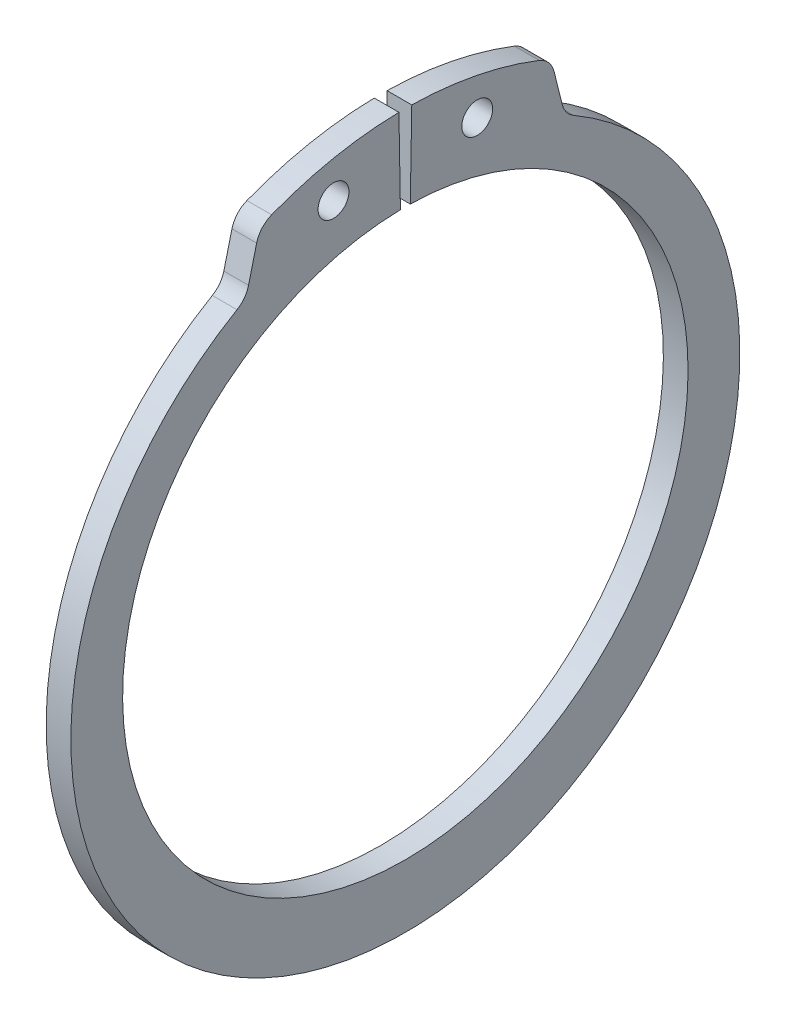
ISO-10303-21;
HEADER;
FILE_DESCRIPTION(('STEP AP214'),'2;1');
FILE_NAME('part.step','',(''),(''),'','','');
FILE_SCHEMA(('AUTOMOTIVE_DESIGN { 1 0 10303 214 1 1 1 1 }'));
ENDSEC;
DATA;
#1=APPLICATION_CONTEXT('core data for automotive mechanical design processes');
#2=APPLICATION_PROTOCOL_DEFINITION('international standard','automotive_design',2000,#1);
#3=PRODUCT_CONTEXT('',#1,'mechanical');
#4=PRODUCT('Part','Part','',(#3));
#5=PRODUCT_RELATED_PRODUCT_CATEGORY('part','',(#4));
#6=PRODUCT_DEFINITION_FORMATION('','',#4);
#7=PRODUCT_DEFINITION_CONTEXT('part definition',#1,'design');
#8=PRODUCT_DEFINITION('design','',#6,#7);
#9=PRODUCT_DEFINITION_SHAPE('','',#8);
#10=(LENGTH_UNIT() NAMED_UNIT(*) SI_UNIT(.MILLI.,.METRE.));
#11=(NAMED_UNIT(*) PLANE_ANGLE_UNIT() SI_UNIT($,.RADIAN.));
#12=(NAMED_UNIT(*) SI_UNIT($,.STERADIAN.) SOLID_ANGLE_UNIT());
#13=UNCERTAINTY_MEASURE_WITH_UNIT(LENGTH_MEASURE(1.E-05),#10,'distance_accuracy_value','');
#14=(GEOMETRIC_REPRESENTATION_CONTEXT(3) GLOBAL_UNCERTAINTY_ASSIGNED_CONTEXT((#13)) GLOBAL_UNIT_ASSIGNED_CONTEXT((#10,
#11,#12)) REPRESENTATION_CONTEXT('',''));
#15=CARTESIAN_POINT('',(0.,0.,0.));
#16=DIRECTION('',(0.,0.,1.));
#17=DIRECTION('',(1.,0.,0.));
#18=AXIS2_PLACEMENT_3D('',#15,#16,#17);
#19=CARTESIAN_POINT('',(1.,0.,0.));
#20=DIRECTION('',(1.,0.,0.));
#21=DIRECTION('',(0.,0.,-1.));
#22=AXIS2_PLACEMENT_3D('',#19,#20,#21);
#23=PLANE('',#22);
#24=CARTESIAN_POINT('',(1.,26.2524208392284,5.82025934285574));
#25=DIRECTION('',(1.,0.,0.));
#26=DIRECTION('',(0.,0.,-1.));
#27=AXIS2_PLACEMENT_3D('',#24,#25,#26);
#28=CIRCLE('',#27,1.25);
#29=CARTESIAN_POINT('',(1.,26.2524208392284,4.57025934285574));
#30=VERTEX_POINT('',#29);
#31=EDGE_CURVE('E221',#30,#30,#28,.T.);
#32=ORIENTED_EDGE('',*,*,#31,.F.);
#33=EDGE_LOOP('',(#32));
#34=FACE_BOUND('',#33,.T.);
#35=CARTESIAN_POINT('',(1.,0.,0.));
#36=DIRECTION('',(1.,0.,0.));
#37=DIRECTION('',(0.,0.,-1.));
#38=AXIS2_PLACEMENT_3D('',#35,#36,#37);
#39=CIRCLE('',#38,29.8);
#40=CARTESIAN_POINT('',(1.,29.7954613156605,0.52008171183105));
#41=VERTEX_POINT('',#40);
#42=CARTESIAN_POINT('',(1.,27.7618124813202,10.8315173337817));
#43=VERTEX_POINT('',#42);
#44=EDGE_CURVE('E138',#41,#43,#39,.T.);
#45=ORIENTED_EDGE('',*,*,#44,.T.);
#46=CARTESIAN_POINT('',(1.,25.8986035899565,10.1045698617158));
#47=DIRECTION('',(1.,0.,0.));
#48=DIRECTION('',(0.,0.,-1.));
#49=AXIS2_PLACEMENT_3D('',#46,#47,#48);
#50=CIRCLE('',#49,2.);
#51=CARTESIAN_POINT('',(1.,26.3824473811558,12.0451613142678));
#52=VERTEX_POINT('',#51);
#53=EDGE_CURVE('E175',#43,#52,#50,.T.);
#54=ORIENTED_EDGE('',*,*,#53,.T.);
#55=DIRECTION('',(0.,-0.970295726275997,0.241921895599665));
#56=VECTOR('',#55,1.);
#57=CARTESIAN_POINT('',(1.,27.364026424585,11.8004261717368));
#58=LINE('',#57,#56);
#59=CARTESIAN_POINT('',(1.,23.7499862908016,12.7015075804882));
#60=VERTEX_POINT('',#59);
#61=EDGE_CURVE('E213',#52,#60,#58,.T.);
#62=ORIENTED_EDGE('',*,*,#61,.T.);
#63=CARTESIAN_POINT('',(1.,24.2338300820009,14.6420990330402));
#64=DIRECTION('',(1.,0.,0.));
#65=DIRECTION('',(0.,0.,-1.));
#66=AXIS2_PLACEMENT_3D('',#63,#64,#65);
#67=CIRCLE('',#66,2.);
#68=CARTESIAN_POINT('',(1.,22.5055810159583,13.635542941348));
#69=VERTEX_POINT('',#68);
#70=EDGE_CURVE('E186',#60,#69,#67,.F.);
#71=ORIENTED_EDGE('',*,*,#70,.T.);
#72=CARTESIAN_POINT('',(1.,-0.906541316689947,0.));
#73=DIRECTION('',(1.,0.,0.));
#74=DIRECTION('',(0.,0.,-1.));
#75=AXIS2_PLACEMENT_3D('',#72,#73,#74);
#76=CIRCLE('',#75,27.0934586833101);
#77=CARTESIAN_POINT('',(1.,22.5055810159583,-13.635542941348));
#78=VERTEX_POINT('',#77);
#79=EDGE_CURVE('E208',#69,#78,#76,.T.);
#80=ORIENTED_EDGE('',*,*,#79,.T.);
#81=CARTESIAN_POINT('',(1.,24.2338300820009,-14.6420990330402));
#82=DIRECTION('',(1.,0.,0.));
#83=DIRECTION('',(0.,0.,-1.));
#84=AXIS2_PLACEMENT_3D('',#81,#82,#83);
#85=CIRCLE('',#84,2.);
#86=CARTESIAN_POINT('',(1.,23.7499862908016,-12.7015075804882));
#87=VERTEX_POINT('',#86);
#88=EDGE_CURVE('E11',#78,#87,#85,.F.);
#89=ORIENTED_EDGE('',*,*,#88,.T.);
#90=DIRECTION('',(0.,0.970295726275998,0.241921895599663));
#91=VECTOR('',#90,1.);
#92=CARTESIAN_POINT('',(1.,27.364026424585,-11.8004261717369));
#93=LINE('',#92,#91);
#94=CARTESIAN_POINT('',(1.,26.3824473811558,-12.0451613142678));
#95=VERTEX_POINT('',#94);
#96=EDGE_CURVE('E207',#87,#95,#93,.T.);
#97=ORIENTED_EDGE('',*,*,#96,.T.);
#98=CARTESIAN_POINT('',(1.,25.8986035899564,-10.1045698617158));
#99=DIRECTION('',(1.,0.,0.));
#100=DIRECTION('',(0.,0.,-1.));
#101=AXIS2_PLACEMENT_3D('',#98,#99,#100);
#102=CIRCLE('',#101,2.);
#103=CARTESIAN_POINT('',(1.,27.7618124813202,-10.8315173337817));
#104=VERTEX_POINT('',#103);
#105=EDGE_CURVE('E53',#95,#104,#102,.T.);
#106=ORIENTED_EDGE('',*,*,#105,.T.);
#107=CARTESIAN_POINT('',(1.,0.,0.));
#108=DIRECTION('',(1.,0.,0.));
#109=DIRECTION('',(0.,0.,1.));
#110=AXIS2_PLACEMENT_3D('',#107,#108,#109);
#111=CIRCLE('',#110,29.8);
#112=CARTESIAN_POINT('',(1.,29.7954613156605,-0.520081711831054));
#113=VERTEX_POINT('',#112);
#114=EDGE_CURVE('E210',#104,#113,#111,.T.);
#115=ORIENTED_EDGE('',*,*,#114,.T.);
#116=DIRECTION('',(0.,-0.999847695156391,0.0174524064372845));
#117=VECTOR('',#116,1.);
#118=CARTESIAN_POINT('',(1.,29.7954613156605,-0.520081711831056));
#119=LINE('',#118,#117);
#120=CARTESIAN_POINT('',(1.,22.8965122190814,-0.399660107413793));
#121=VERTEX_POINT('',#120);
#122=EDGE_CURVE('E144',#113,#121,#119,.T.);
#123=ORIENTED_EDGE('',*,*,#122,.T.);
#124=CARTESIAN_POINT('',(1.,0.,0.));
#125=DIRECTION('',(-1.,0.,0.));
#126=DIRECTION('',(0.,0.,-1.));
#127=AXIS2_PLACEMENT_3D('',#124,#125,#126);
#128=CIRCLE('',#127,22.9);
#129=CARTESIAN_POINT('',(1.,22.8965122190814,0.399660107413793));
#130=VERTEX_POINT('',#129);
#131=EDGE_CURVE('E139',#121,#130,#128,.T.);
#132=ORIENTED_EDGE('',*,*,#131,.T.);
#133=DIRECTION('',(0.,0.999847695156391,0.0174524064372835));
#134=VECTOR('',#133,1.);
#135=CARTESIAN_POINT('',(1.,22.8965122190814,0.399660107413793));
#136=LINE('',#135,#134);
#137=EDGE_CURVE('E128',#130,#41,#136,.T.);
#138=ORIENTED_EDGE('',*,*,#137,.T.);
#139=EDGE_LOOP('',(#45,#54,#62,#71,#80,#89,#97,#106,#115,#123,#132,#138));
#140=FACE_BOUND('',#139,.T.);
#141=CARTESIAN_POINT('',(1.,26.2524208392284,-5.82025934285574));
#142=DIRECTION('',(1.,0.,0.));
#143=DIRECTION('',(0.,0.,-1.));
#144=AXIS2_PLACEMENT_3D('',#141,#142,#143);
#145=CIRCLE('',#144,1.25);
#146=CARTESIAN_POINT('',(1.,26.2524208392284,-7.07025934285574));
#147=VERTEX_POINT('',#146);
#148=EDGE_CURVE('E250',#147,#147,#145,.T.);
#149=ORIENTED_EDGE('',*,*,#148,.F.);
#150=EDGE_LOOP('',(#149));
#151=FACE_BOUND('',#150,.T.);
#152=ADVANCED_FACE('F38',(#34,#140,#151),#23,.T.);
#153=CARTESIAN_POINT('',(-1.,0.,0.));
#154=DIRECTION('',(1.,0.,0.));
#155=DIRECTION('',(0.,0.,-1.));
#156=AXIS2_PLACEMENT_3D('',#153,#154,#155);
#157=PLANE('',#156);
#158=CARTESIAN_POINT('',(-1.,26.2524208392284,5.82025934285574));
#159=DIRECTION('',(1.,0.,0.));
#160=DIRECTION('',(0.,0.,-1.));
#161=AXIS2_PLACEMENT_3D('',#158,#159,#160);
#162=CIRCLE('',#161,1.25);
#163=CARTESIAN_POINT('',(-1.,26.2524208392284,4.57025934285574));
#164=VERTEX_POINT('',#163);
#165=EDGE_CURVE('E247',#164,#164,#162,.T.);
#166=ORIENTED_EDGE('',*,*,#165,.T.);
#167=EDGE_LOOP('',(#166));
#168=FACE_BOUND('',#167,.T.);
#169=DIRECTION('',(0.,-0.970295726275997,0.241921895599665));
#170=VECTOR('',#169,1.);
#171=CARTESIAN_POINT('',(-1.,27.364026424585,11.8004261717368));
#172=LINE('',#171,#170);
#173=CARTESIAN_POINT('',(-1.,26.3824473811558,12.0451613142678));
#174=VERTEX_POINT('',#173);
#175=CARTESIAN_POINT('',(-1.,23.7499862908016,12.7015075804882));
#176=VERTEX_POINT('',#175);
#177=EDGE_CURVE('E204',#174,#176,#172,.T.);
#178=ORIENTED_EDGE('',*,*,#177,.F.);
#179=CARTESIAN_POINT('',(-1.,25.8986035899565,10.1045698617158));
#180=DIRECTION('',(1.,0.,0.));
#181=DIRECTION('',(0.,0.,-1.));
#182=AXIS2_PLACEMENT_3D('',#179,#180,#181);
#183=CIRCLE('',#182,2.);
#184=CARTESIAN_POINT('',(-1.,27.7618124813202,10.8315173337817));
#185=VERTEX_POINT('',#184);
#186=EDGE_CURVE('E170',#174,#185,#183,.F.);
#187=ORIENTED_EDGE('',*,*,#186,.T.);
#188=CARTESIAN_POINT('',(-1.,0.,0.));
#189=DIRECTION('',(1.,0.,0.));
#190=DIRECTION('',(0.,0.,-1.));
#191=AXIS2_PLACEMENT_3D('',#188,#189,#190);
#192=CIRCLE('',#191,29.8);
#193=CARTESIAN_POINT('',(-1.,29.7954613156605,0.52008171183105));
#194=VERTEX_POINT('',#193);
#195=EDGE_CURVE('E223',#194,#185,#192,.T.);
#196=ORIENTED_EDGE('',*,*,#195,.F.);
#197=DIRECTION('',(0.,0.999847695156391,0.0174524064372835));
#198=VECTOR('',#197,1.);
#199=CARTESIAN_POINT('',(-1.,22.8965122190814,0.399660107413793));
#200=LINE('',#199,#198);
#201=CARTESIAN_POINT('',(-1.,22.8965122190814,0.399660107413793));
#202=VERTEX_POINT('',#201);
#203=EDGE_CURVE('E220',#202,#194,#200,.T.);
#204=ORIENTED_EDGE('',*,*,#203,.F.);
#205=CARTESIAN_POINT('',(-1.,0.,0.));
#206=DIRECTION('',(-1.,0.,0.));
#207=DIRECTION('',(0.,0.,-1.));
#208=AXIS2_PLACEMENT_3D('',#205,#206,#207);
#209=CIRCLE('',#208,22.9);
#210=CARTESIAN_POINT('',(-1.,22.8965122190814,-0.399660107413793));
#211=VERTEX_POINT('',#210);
#212=EDGE_CURVE('E152',#211,#202,#209,.T.);
#213=ORIENTED_EDGE('',*,*,#212,.F.);
#214=DIRECTION('',(0.,-0.999847695156391,0.0174524064372845));
#215=VECTOR('',#214,1.);
#216=CARTESIAN_POINT('',(-1.,29.7954613156605,-0.520081711831056));
#217=LINE('',#216,#215);
#218=CARTESIAN_POINT('',(-1.,29.7954613156605,-0.520081711831054));
#219=VERTEX_POINT('',#218);
#220=EDGE_CURVE('E148',#219,#211,#217,.T.);
#221=ORIENTED_EDGE('',*,*,#220,.F.);
#222=CARTESIAN_POINT('',(-1.,0.,0.));
#223=DIRECTION('',(1.,0.,0.));
#224=DIRECTION('',(0.,0.,1.));
#225=AXIS2_PLACEMENT_3D('',#222,#223,#224);
#226=CIRCLE('',#225,29.8);
#227=CARTESIAN_POINT('',(-1.,27.7618124813202,-10.8315173337817));
#228=VERTEX_POINT('',#227);
#229=EDGE_CURVE('E229',#228,#219,#226,.T.);
#230=ORIENTED_EDGE('',*,*,#229,.F.);
#231=CARTESIAN_POINT('',(-1.,25.8986035899564,-10.1045698617158));
#232=DIRECTION('',(1.,0.,0.));
#233=DIRECTION('',(0.,0.,-1.));
#234=AXIS2_PLACEMENT_3D('',#231,#232,#233);
#235=CIRCLE('',#234,2.);
#236=CARTESIAN_POINT('',(-1.,26.3824473811558,-12.0451613142678));
#237=VERTEX_POINT('',#236);
#238=EDGE_CURVE('E168',#228,#237,#235,.F.);
#239=ORIENTED_EDGE('',*,*,#238,.T.);
#240=DIRECTION('',(0.,0.970295726275998,0.241921895599663));
#241=VECTOR('',#240,1.);
#242=CARTESIAN_POINT('',(-1.,27.364026424585,-11.8004261717369));
#243=LINE('',#242,#241);
#244=CARTESIAN_POINT('',(-1.,23.7499862908016,-12.7015075804882));
#245=VERTEX_POINT('',#244);
#246=EDGE_CURVE('E195',#245,#237,#243,.T.);
#247=ORIENTED_EDGE('',*,*,#246,.F.);
#248=CARTESIAN_POINT('',(-1.,24.2338300820009,-14.6420990330402));
#249=DIRECTION('',(1.,0.,0.));
#250=DIRECTION('',(0.,0.,-1.));
#251=AXIS2_PLACEMENT_3D('',#248,#249,#250);
#252=CIRCLE('',#251,2.);
#253=CARTESIAN_POINT('',(-1.,22.5055810159583,-13.635542941348));
#254=VERTEX_POINT('',#253);
#255=EDGE_CURVE('E46',#245,#254,#252,.T.);
#256=ORIENTED_EDGE('',*,*,#255,.T.);
#257=CARTESIAN_POINT('',(-1.,-0.906541316689947,0.));
#258=DIRECTION('',(1.,0.,0.));
#259=DIRECTION('',(0.,0.,-1.));
#260=AXIS2_PLACEMENT_3D('',#257,#258,#259);
#261=CIRCLE('',#260,27.0934586833101);
#262=CARTESIAN_POINT('',(-1.,22.5055810159583,13.635542941348));
#263=VERTEX_POINT('',#262);
#264=EDGE_CURVE('E194',#263,#254,#261,.T.);
#265=ORIENTED_EDGE('',*,*,#264,.F.);
#266=CARTESIAN_POINT('',(-1.,24.2338300820009,14.6420990330402));
#267=DIRECTION('',(1.,0.,0.));
#268=DIRECTION('',(0.,0.,-1.));
#269=AXIS2_PLACEMENT_3D('',#266,#267,#268);
#270=CIRCLE('',#269,2.);
#271=EDGE_CURVE('E184',#263,#176,#270,.T.);
#272=ORIENTED_EDGE('',*,*,#271,.T.);
#273=EDGE_LOOP('',(#178,#187,#196,#204,#213,#221,#230,#239,#247,#256,#265,#272));
#274=FACE_BOUND('',#273,.T.);
#275=CARTESIAN_POINT('',(-1.,26.2524208392284,-5.82025934285574));
#276=DIRECTION('',(1.,0.,0.));
#277=DIRECTION('',(0.,0.,-1.));
#278=AXIS2_PLACEMENT_3D('',#275,#276,#277);
#279=CIRCLE('',#278,1.25);
#280=CARTESIAN_POINT('',(-1.,26.2524208392284,-7.07025934285574));
#281=VERTEX_POINT('',#280);
#282=EDGE_CURVE('E253',#281,#281,#279,.T.);
#283=ORIENTED_EDGE('',*,*,#282,.T.);
#284=EDGE_LOOP('',(#283));
#285=FACE_BOUND('',#284,.T.);
#286=ADVANCED_FACE('F192',(#168,#274,#285),#157,.F.);
#287=CARTESIAN_POINT('',(1.,0.,0.));
#288=DIRECTION('',(-1.,0.,0.));
#289=DIRECTION('',(0.,0.,1.));
#290=AXIS2_PLACEMENT_3D('',#287,#288,#289);
#291=CYLINDRICAL_SURFACE('',#290,22.9);
#292=ORIENTED_EDGE('',*,*,#212,.T.);
#293=DIRECTION('',(-1.,0.,0.));
#294=VECTOR('',#293,1.);
#295=CARTESIAN_POINT('',(1.,22.8965122190814,0.399660107413793));
#296=LINE('',#295,#294);
#297=EDGE_CURVE('E132',#130,#202,#296,.T.);
#298=ORIENTED_EDGE('',*,*,#297,.F.);
#299=ORIENTED_EDGE('',*,*,#131,.F.);
#300=DIRECTION('',(-1.,0.,0.));
#301=VECTOR('',#300,1.);
#302=CARTESIAN_POINT('',(1.,22.8965122190814,-0.399660107413793));
#303=LINE('',#302,#301);
#304=EDGE_CURVE('E218',#121,#211,#303,.T.);
#305=ORIENTED_EDGE('',*,*,#304,.T.);
#306=EDGE_LOOP('',(#292,#298,#299,#305));
#307=FACE_BOUND('',#306,.T.);
#308=ADVANCED_FACE('F150',(#307),#291,.F.);
#309=CARTESIAN_POINT('',(1.,22.8965122190814,0.399660107413793));
#310=DIRECTION('',(0.,-0.0174524064372835,0.999847695156391));
#311=DIRECTION('',(0.,-0.999847695156391,-0.0174524064372835));
#312=AXIS2_PLACEMENT_3D('',#309,#310,#311);
#313=PLANE('',#312);
#314=ORIENTED_EDGE('',*,*,#203,.T.);
#315=DIRECTION('',(-1.,0.,0.));
#316=VECTOR('',#315,1.);
#317=CARTESIAN_POINT('',(1.,29.7954613156605,0.52008171183105));
#318=LINE('',#317,#316);
#319=EDGE_CURVE('E135',#41,#194,#318,.T.);
#320=ORIENTED_EDGE('',*,*,#319,.F.);
#321=ORIENTED_EDGE('',*,*,#137,.F.);
#322=ORIENTED_EDGE('',*,*,#297,.T.);
#323=EDGE_LOOP('',(#314,#320,#321,#322));
#324=FACE_BOUND('',#323,.T.);
#325=ADVANCED_FACE('F130',(#324),#313,.F.);
#326=CARTESIAN_POINT('',(1.,0.,0.));
#327=DIRECTION('',(-1.,0.,0.));
#328=DIRECTION('',(0.,0.,1.));
#329=AXIS2_PLACEMENT_3D('',#326,#327,#328);
#330=CYLINDRICAL_SURFACE('',#329,29.8);
#331=ORIENTED_EDGE('',*,*,#195,.T.);
#332=DIRECTION('',(-1.,0.,0.));
#333=VECTOR('',#332,1.);
#334=CARTESIAN_POINT('',(1.,27.7618124813202,10.8315173337817));
#335=LINE('',#334,#333);
#336=EDGE_CURVE('E172',#185,#43,#335,.F.);
#337=ORIENTED_EDGE('',*,*,#336,.T.);
#338=ORIENTED_EDGE('',*,*,#44,.F.);
#339=ORIENTED_EDGE('',*,*,#319,.T.);
#340=EDGE_LOOP('',(#331,#337,#338,#339));
#341=FACE_BOUND('',#340,.T.);
#342=ADVANCED_FACE('F241',(#341),#330,.T.);
#343=CARTESIAN_POINT('',(1.,27.364026424585,11.8004261717368));
#344=DIRECTION('',(0.,-0.241921895599665,-0.970295726275997));
#345=DIRECTION('',(0.,0.970295726275997,-0.241921895599665));
#346=AXIS2_PLACEMENT_3D('',#343,#344,#345);
#347=PLANE('',#346);
#348=ORIENTED_EDGE('',*,*,#177,.T.);
#349=DIRECTION('',(1.,0.,0.));
#350=VECTOR('',#349,1.);
#351=CARTESIAN_POINT('',(1.,23.7499862908016,12.7015075804882));
#352=LINE('',#351,#350);
#353=EDGE_CURVE('E166',#176,#60,#352,.T.);
#354=ORIENTED_EDGE('',*,*,#353,.T.);
#355=ORIENTED_EDGE('',*,*,#61,.F.);
#356=DIRECTION('',(-1.,0.,0.));
#357=VECTOR('',#356,1.);
#358=CARTESIAN_POINT('',(1.,26.3824473811558,12.0451613142678));
#359=LINE('',#358,#357);
#360=EDGE_CURVE('E163',#52,#174,#359,.T.);
#361=ORIENTED_EDGE('',*,*,#360,.T.);
#362=EDGE_LOOP('',(#348,#354,#355,#361));
#363=FACE_BOUND('',#362,.T.);
#364=ADVANCED_FACE('F283',(#363),#347,.F.);
#365=CARTESIAN_POINT('',(1.,-0.906541316689947,0.));
#366=DIRECTION('',(-1.,0.,0.));
#367=DIRECTION('',(0.,0.,1.));
#368=AXIS2_PLACEMENT_3D('',#365,#366,#367);
#369=CYLINDRICAL_SURFACE('',#368,27.0934586833101);
#370=ORIENTED_EDGE('',*,*,#79,.F.);
#371=DIRECTION('',(-1.,0.,0.));
#372=VECTOR('',#371,1.);
#373=CARTESIAN_POINT('',(1.,22.5055810159583,13.635542941348));
#374=LINE('',#373,#372);
#375=EDGE_CURVE('E155',#69,#263,#374,.T.);
#376=ORIENTED_EDGE('',*,*,#375,.T.);
#377=ORIENTED_EDGE('',*,*,#264,.T.);
#378=DIRECTION('',(-1.,0.,0.));
#379=VECTOR('',#378,1.);
#380=CARTESIAN_POINT('',(1.,22.5055810159583,-13.635542941348));
#381=LINE('',#380,#379);
#382=EDGE_CURVE('E153',#254,#78,#381,.F.);
#383=ORIENTED_EDGE('',*,*,#382,.T.);
#384=EDGE_LOOP('',(#370,#376,#377,#383));
#385=FACE_BOUND('',#384,.T.);
#386=ADVANCED_FACE('F201',(#385),#369,.T.);
#387=CARTESIAN_POINT('',(1.,27.364026424585,-11.8004261717369));
#388=DIRECTION('',(0.,-0.241921895599663,0.970295726275998));
#389=DIRECTION('',(0.,-0.970295726275998,-0.241921895599663));
#390=AXIS2_PLACEMENT_3D('',#387,#388,#389);
#391=PLANE('',#390);
#392=ORIENTED_EDGE('',*,*,#246,.T.);
#393=DIRECTION('',(-1.,0.,0.));
#394=VECTOR('',#393,1.);
#395=CARTESIAN_POINT('',(1.,26.3824473811558,-12.0451613142678));
#396=LINE('',#395,#394);
#397=EDGE_CURVE('E61',#237,#95,#396,.F.);
#398=ORIENTED_EDGE('',*,*,#397,.T.);
#399=ORIENTED_EDGE('',*,*,#96,.F.);
#400=DIRECTION('',(1.,0.,0.));
#401=VECTOR('',#400,1.);
#402=CARTESIAN_POINT('',(-1.,23.7499862908016,-12.7015075804882));
#403=LINE('',#402,#401);
#404=EDGE_CURVE('E180',#87,#245,#403,.F.);
#405=ORIENTED_EDGE('',*,*,#404,.T.);
#406=EDGE_LOOP('',(#392,#398,#399,#405));
#407=FACE_BOUND('',#406,.T.);
#408=ADVANCED_FACE('F209',(#407),#391,.F.);
#409=CARTESIAN_POINT('',(1.,0.,0.));
#410=DIRECTION('',(-1.,0.,0.));
#411=DIRECTION('',(0.,0.,1.));
#412=AXIS2_PLACEMENT_3D('',#409,#410,#411);
#413=CYLINDRICAL_SURFACE('',#412,29.8);
#414=ORIENTED_EDGE('',*,*,#114,.F.);
#415=DIRECTION('',(-1.,0.,0.));
#416=VECTOR('',#415,1.);
#417=CARTESIAN_POINT('',(1.,27.7618124813202,-10.8315173337817));
#418=LINE('',#417,#416);
#419=EDGE_CURVE('E177',#104,#228,#418,.T.);
#420=ORIENTED_EDGE('',*,*,#419,.T.);
#421=ORIENTED_EDGE('',*,*,#229,.T.);
#422=DIRECTION('',(-1.,0.,0.));
#423=VECTOR('',#422,1.);
#424=CARTESIAN_POINT('',(1.,29.7954613156605,-0.520081711831054));
#425=LINE('',#424,#423);
#426=EDGE_CURVE('E157',#113,#219,#425,.T.);
#427=ORIENTED_EDGE('',*,*,#426,.F.);
#428=EDGE_LOOP('',(#414,#420,#421,#427));
#429=FACE_BOUND('',#428,.T.);
#430=ADVANCED_FACE('F276',(#429),#413,.T.);
#431=CARTESIAN_POINT('',(1.,29.7954613156605,-0.520081711831056));
#432=DIRECTION('',(0.,-0.0174524064372845,-0.999847695156391));
#433=DIRECTION('',(0.,0.999847695156391,-0.0174524064372845));
#434=AXIS2_PLACEMENT_3D('',#431,#432,#433);
#435=PLANE('',#434);
#436=ORIENTED_EDGE('',*,*,#220,.T.);
#437=ORIENTED_EDGE('',*,*,#304,.F.);
#438=ORIENTED_EDGE('',*,*,#122,.F.);
#439=ORIENTED_EDGE('',*,*,#426,.T.);
#440=EDGE_LOOP('',(#436,#437,#438,#439));
#441=FACE_BOUND('',#440,.T.);
#442=ADVANCED_FACE('F236',(#441),#435,.F.);
#443=CARTESIAN_POINT('',(1.,26.2524208392284,5.82025934285574));
#444=DIRECTION('',(-1.,0.,0.));
#445=DIRECTION('',(0.,0.,1.));
#446=AXIS2_PLACEMENT_3D('',#443,#444,#445);
#447=CYLINDRICAL_SURFACE('',#446,1.25);
#448=ORIENTED_EDGE('',*,*,#31,.T.);
#449=EDGE_LOOP('',(#448));
#450=FACE_BOUND('',#449,.T.);
#451=ORIENTED_EDGE('',*,*,#165,.F.);
#452=EDGE_LOOP('',(#451));
#453=FACE_BOUND('',#452,.T.);
#454=ADVANCED_FACE('F271',(#450,#453),#447,.F.);
#455=CARTESIAN_POINT('',(1.,26.2524208392284,-5.82025934285574));
#456=DIRECTION('',(-1.,0.,0.));
#457=DIRECTION('',(0.,0.,1.));
#458=AXIS2_PLACEMENT_3D('',#455,#456,#457);
#459=CYLINDRICAL_SURFACE('',#458,1.25);
#460=ORIENTED_EDGE('',*,*,#148,.T.);
#461=EDGE_LOOP('',(#460));
#462=FACE_BOUND('',#461,.T.);
#463=ORIENTED_EDGE('',*,*,#282,.F.);
#464=EDGE_LOOP('',(#463));
#465=FACE_BOUND('',#464,.T.);
#466=ADVANCED_FACE('F259',(#462,#465),#459,.F.);
#467=CARTESIAN_POINT('',(1.,24.2338300820009,14.6420990330402));
#468=DIRECTION('',(-1.,0.,0.));
#469=DIRECTION('',(0.,0.,1.));
#470=AXIS2_PLACEMENT_3D('',#467,#468,#469);
#471=CYLINDRICAL_SURFACE('',#470,2.);
#472=ORIENTED_EDGE('',*,*,#70,.F.);
#473=ORIENTED_EDGE('',*,*,#353,.F.);
#474=ORIENTED_EDGE('',*,*,#271,.F.);
#475=ORIENTED_EDGE('',*,*,#375,.F.);
#476=EDGE_LOOP('',(#472,#473,#474,#475));
#477=FACE_BOUND('',#476,.T.);
#478=ADVANCED_FACE('F293',(#477),#471,.F.);
#479=CARTESIAN_POINT('',(1.,25.8986035899565,10.1045698617158));
#480=DIRECTION('',(-1.,0.,0.));
#481=DIRECTION('',(0.,0.,1.));
#482=AXIS2_PLACEMENT_3D('',#479,#480,#481);
#483=CYLINDRICAL_SURFACE('',#482,2.);
#484=ORIENTED_EDGE('',*,*,#53,.F.);
#485=ORIENTED_EDGE('',*,*,#336,.F.);
#486=ORIENTED_EDGE('',*,*,#186,.F.);
#487=ORIENTED_EDGE('',*,*,#360,.F.);
#488=EDGE_LOOP('',(#484,#485,#486,#487));
#489=FACE_BOUND('',#488,.T.);
#490=ADVANCED_FACE('F296',(#489),#483,.T.);
#491=CARTESIAN_POINT('',(1.,25.8986035899564,-10.1045698617158));
#492=DIRECTION('',(-1.,0.,0.));
#493=DIRECTION('',(0.,0.,1.));
#494=AXIS2_PLACEMENT_3D('',#491,#492,#493);
#495=CYLINDRICAL_SURFACE('',#494,2.);
#496=ORIENTED_EDGE('',*,*,#105,.F.);
#497=ORIENTED_EDGE('',*,*,#397,.F.);
#498=ORIENTED_EDGE('',*,*,#238,.F.);
#499=ORIENTED_EDGE('',*,*,#419,.F.);
#500=EDGE_LOOP('',(#496,#497,#498,#499));
#501=FACE_BOUND('',#500,.T.);
#502=ADVANCED_FACE('F299',(#501),#495,.T.);
#503=CARTESIAN_POINT('',(1.,24.2338300820009,-14.6420990330402));
#504=DIRECTION('',(-1.,0.,0.));
#505=DIRECTION('',(0.,0.,1.));
#506=AXIS2_PLACEMENT_3D('',#503,#504,#505);
#507=CYLINDRICAL_SURFACE('',#506,2.);
#508=ORIENTED_EDGE('',*,*,#88,.F.);
#509=ORIENTED_EDGE('',*,*,#382,.F.);
#510=ORIENTED_EDGE('',*,*,#255,.F.);
#511=ORIENTED_EDGE('',*,*,#404,.F.);
#512=EDGE_LOOP('',(#508,#509,#510,#511));
#513=FACE_BOUND('',#512,.T.);
#514=ADVANCED_FACE('F40',(#513),#507,.F.);
#515=CLOSED_SHELL('',(#152,#286,#308,#325,#342,#364,#386,#408,#430,#442,#454,#466,#478,#490,
#502,#514));
#516=MANIFOLD_SOLID_BREP('B2',#515);
#517=ADVANCED_BREP_SHAPE_REPRESENTATION('',(#18,#516),#14);
#518=SHAPE_DEFINITION_REPRESENTATION(#9,#517);
ENDSEC;
END-ISO-10303-21;
